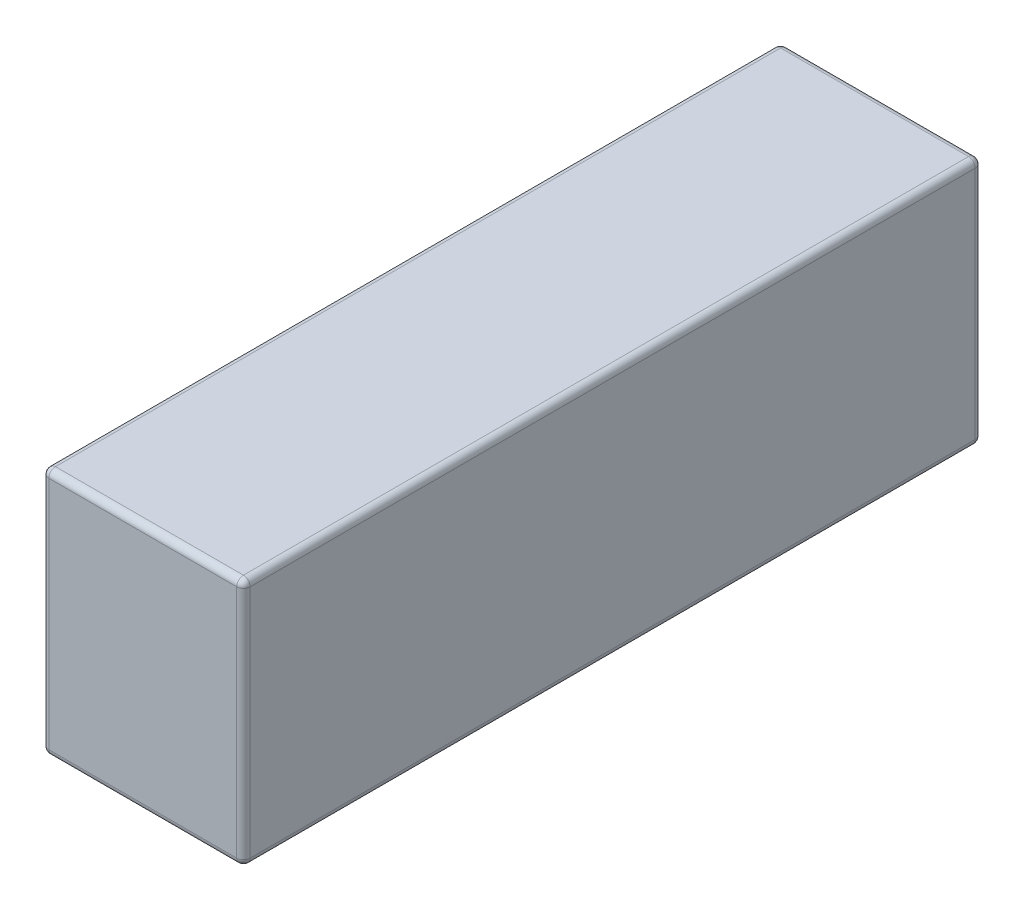
ISO-10303-21;
HEADER;
FILE_DESCRIPTION(('STEP AP214'),'2;1');
FILE_NAME('part.step','',(''),(''),'','','');
FILE_SCHEMA(('AUTOMOTIVE_DESIGN { 1 0 10303 214 1 1 1 1 }'));
ENDSEC;
DATA;
#1=APPLICATION_CONTEXT('core data for automotive mechanical design processes');
#2=APPLICATION_PROTOCOL_DEFINITION('international standard','automotive_design',2000,#1);
#3=PRODUCT_CONTEXT('',#1,'mechanical');
#4=PRODUCT('Part','Part','',(#3));
#5=PRODUCT_RELATED_PRODUCT_CATEGORY('part','',(#4));
#6=PRODUCT_DEFINITION_FORMATION('','',#4);
#7=PRODUCT_DEFINITION_CONTEXT('part definition',#1,'design');
#8=PRODUCT_DEFINITION('design','',#6,#7);
#9=PRODUCT_DEFINITION_SHAPE('','',#8);
#10=(LENGTH_UNIT() NAMED_UNIT(*) SI_UNIT(.MILLI.,.METRE.));
#11=(NAMED_UNIT(*) PLANE_ANGLE_UNIT() SI_UNIT($,.RADIAN.));
#12=(NAMED_UNIT(*) SI_UNIT($,.STERADIAN.) SOLID_ANGLE_UNIT());
#13=UNCERTAINTY_MEASURE_WITH_UNIT(LENGTH_MEASURE(1.E-05),#10,'distance_accuracy_value','');
#14=(GEOMETRIC_REPRESENTATION_CONTEXT(3) GLOBAL_UNCERTAINTY_ASSIGNED_CONTEXT((#13)) GLOBAL_UNIT_ASSIGNED_CONTEXT((#10,
#11,#12)) REPRESENTATION_CONTEXT('',''));
#15=CARTESIAN_POINT('',(0.,0.,0.));
#16=DIRECTION('',(0.,0.,1.));
#17=DIRECTION('',(1.,0.,0.));
#18=AXIS2_PLACEMENT_3D('',#15,#16,#17);
#19=CARTESIAN_POINT('',(-15.,37.,59.5535714285715));
#20=DIRECTION('',(1.,0.,0.));
#21=DIRECTION('',(0.,0.,-1.));
#22=AXIS2_PLACEMENT_3D('',#19,#20,#21);
#23=PLANE('',#22);
#24=DIRECTION('',(0.,0.,1.));
#25=VECTOR('',#24,1.);
#26=CARTESIAN_POINT('',(-15.,36.,-50.4464285714285));
#27=LINE('',#26,#25);
#28=CARTESIAN_POINT('',(-15.,36.,58.5535714285715));
#29=VERTEX_POINT('',#28);
#30=CARTESIAN_POINT('',(-15.,36.,-49.4464285714285));
#31=VERTEX_POINT('',#30);
#32=EDGE_CURVE('E173',#29,#31,#27,.F.);
#33=ORIENTED_EDGE('',*,*,#32,.T.);
#34=DIRECTION('',(0.,-1.,0.));
#35=VECTOR('',#34,1.);
#36=CARTESIAN_POINT('',(-15.,37.,-49.4464285714285));
#37=LINE('',#36,#35);
#38=CARTESIAN_POINT('',(-15.,1.,-49.4464285714285));
#39=VERTEX_POINT('',#38);
#40=EDGE_CURVE('E179',#31,#39,#37,.T.);
#41=ORIENTED_EDGE('',*,*,#40,.T.);
#42=DIRECTION('',(0.,0.,1.));
#43=VECTOR('',#42,1.);
#44=CARTESIAN_POINT('',(-15.,1.,59.5535714285715));
#45=LINE('',#44,#43);
#46=CARTESIAN_POINT('',(-15.,1.,58.5535714285715));
#47=VERTEX_POINT('',#46);
#48=EDGE_CURVE('E177',#39,#47,#45,.T.);
#49=ORIENTED_EDGE('',*,*,#48,.T.);
#50=DIRECTION('',(0.,-1.,0.));
#51=VECTOR('',#50,1.);
#52=CARTESIAN_POINT('',(-15.,37.,58.5535714285715));
#53=LINE('',#52,#51);
#54=EDGE_CURVE('E175',#47,#29,#53,.F.);
#55=ORIENTED_EDGE('',*,*,#54,.T.);
#56=EDGE_LOOP('',(#33,#41,#49,#55));
#57=FACE_BOUND('',#56,.T.);
#58=ADVANCED_FACE('F33',(#57),#23,.F.);
#59=CARTESIAN_POINT('',(15.,37.,59.5535714285715));
#60=DIRECTION('',(0.,0.,-1.));
#61=DIRECTION('',(-1.,0.,0.));
#62=AXIS2_PLACEMENT_3D('',#59,#60,#61);
#63=PLANE('',#62);
#64=DIRECTION('',(1.,0.,0.));
#65=VECTOR('',#64,1.);
#66=CARTESIAN_POINT('',(-15.,36.,59.5535714285715));
#67=LINE('',#66,#65);
#68=CARTESIAN_POINT('',(14.,36.,59.5535714285715));
#69=VERTEX_POINT('',#68);
#70=CARTESIAN_POINT('',(-14.,36.,59.5535714285715));
#71=VERTEX_POINT('',#70);
#72=EDGE_CURVE('E184',#69,#71,#67,.F.);
#73=ORIENTED_EDGE('',*,*,#72,.T.);
#74=DIRECTION('',(0.,-1.,0.));
#75=VECTOR('',#74,1.);
#76=CARTESIAN_POINT('',(-14.,37.,59.5535714285715));
#77=LINE('',#76,#75);
#78=CARTESIAN_POINT('',(-14.,1.,59.5535714285715));
#79=VERTEX_POINT('',#78);
#80=EDGE_CURVE('E188',#71,#79,#77,.T.);
#81=ORIENTED_EDGE('',*,*,#80,.T.);
#82=DIRECTION('',(1.,0.,0.));
#83=VECTOR('',#82,1.);
#84=CARTESIAN_POINT('',(15.,1.,59.5535714285715));
#85=LINE('',#84,#83);
#86=CARTESIAN_POINT('',(14.,1.,59.5535714285715));
#87=VERTEX_POINT('',#86);
#88=EDGE_CURVE('E186',#79,#87,#85,.T.);
#89=ORIENTED_EDGE('',*,*,#88,.T.);
#90=DIRECTION('',(0.,-1.,0.));
#91=VECTOR('',#90,1.);
#92=CARTESIAN_POINT('',(14.,37.,59.5535714285715));
#93=LINE('',#92,#91);
#94=EDGE_CURVE('E182',#87,#69,#93,.F.);
#95=ORIENTED_EDGE('',*,*,#94,.T.);
#96=EDGE_LOOP('',(#73,#81,#89,#95));
#97=FACE_BOUND('',#96,.T.);
#98=ADVANCED_FACE('F272',(#97),#63,.F.);
#99=CARTESIAN_POINT('',(15.,37.,59.5535714285715));
#100=DIRECTION('',(-1.,0.,0.));
#101=DIRECTION('',(0.,0.,1.));
#102=AXIS2_PLACEMENT_3D('',#99,#100,#101);
#103=PLANE('',#102);
#104=DIRECTION('',(0.,0.,-1.));
#105=VECTOR('',#104,1.);
#106=CARTESIAN_POINT('',(15.,36.,59.5535714285715));
#107=LINE('',#106,#105);
#108=CARTESIAN_POINT('',(15.,36.,-49.4464285714285));
#109=VERTEX_POINT('',#108);
#110=CARTESIAN_POINT('',(15.,36.,58.5535714285715));
#111=VERTEX_POINT('',#110);
#112=EDGE_CURVE('E42',#109,#111,#107,.F.);
#113=ORIENTED_EDGE('',*,*,#112,.T.);
#114=DIRECTION('',(0.,-1.,0.));
#115=VECTOR('',#114,1.);
#116=CARTESIAN_POINT('',(15.,37.,58.5535714285715));
#117=LINE('',#116,#115);
#118=CARTESIAN_POINT('',(15.,1.,58.5535714285715));
#119=VERTEX_POINT('',#118);
#120=EDGE_CURVE('E11',#111,#119,#117,.T.);
#121=ORIENTED_EDGE('',*,*,#120,.T.);
#122=DIRECTION('',(0.,0.,-1.));
#123=VECTOR('',#122,1.);
#124=CARTESIAN_POINT('',(15.,1.,59.5535714285715));
#125=LINE('',#124,#123);
#126=CARTESIAN_POINT('',(15.,1.,-49.4464285714285));
#127=VERTEX_POINT('',#126);
#128=EDGE_CURVE('E198',#119,#127,#125,.T.);
#129=ORIENTED_EDGE('',*,*,#128,.T.);
#130=DIRECTION('',(0.,-1.,0.));
#131=VECTOR('',#130,1.);
#132=CARTESIAN_POINT('',(15.,37.,-49.4464285714285));
#133=LINE('',#132,#131);
#134=EDGE_CURVE('E53',#127,#109,#133,.F.);
#135=ORIENTED_EDGE('',*,*,#134,.T.);
#136=EDGE_LOOP('',(#113,#121,#129,#135));
#137=FACE_BOUND('',#136,.T.);
#138=ADVANCED_FACE('F285',(#137),#103,.F.);
#139=CARTESIAN_POINT('',(15.,37.,-50.4464285714285));
#140=DIRECTION('',(0.,0.,1.));
#141=DIRECTION('',(1.,0.,0.));
#142=AXIS2_PLACEMENT_3D('',#139,#140,#141);
#143=PLANE('',#142);
#144=DIRECTION('',(0.,-1.,0.));
#145=VECTOR('',#144,1.);
#146=CARTESIAN_POINT('',(14.,37.,-50.4464285714285));
#147=LINE('',#146,#145);
#148=CARTESIAN_POINT('',(14.,36.,-50.4464285714285));
#149=VERTEX_POINT('',#148);
#150=CARTESIAN_POINT('',(14.,1.,-50.4464285714285));
#151=VERTEX_POINT('',#150);
#152=EDGE_CURVE('E125',#149,#151,#147,.T.);
#153=ORIENTED_EDGE('',*,*,#152,.T.);
#154=DIRECTION('',(-1.,0.,0.));
#155=VECTOR('',#154,1.);
#156=CARTESIAN_POINT('',(15.,1.,-50.4464285714285));
#157=LINE('',#156,#155);
#158=CARTESIAN_POINT('',(-14.,1.,-50.4464285714285));
#159=VERTEX_POINT('',#158);
#160=EDGE_CURVE('E162',#151,#159,#157,.T.);
#161=ORIENTED_EDGE('',*,*,#160,.T.);
#162=DIRECTION('',(0.,-1.,0.));
#163=VECTOR('',#162,1.);
#164=CARTESIAN_POINT('',(-14.,37.,-50.4464285714285));
#165=LINE('',#164,#163);
#166=CARTESIAN_POINT('',(-14.,36.,-50.4464285714285));
#167=VERTEX_POINT('',#166);
#168=EDGE_CURVE('E128',#159,#167,#165,.F.);
#169=ORIENTED_EDGE('',*,*,#168,.T.);
#170=DIRECTION('',(-1.,0.,0.));
#171=VECTOR('',#170,1.);
#172=CARTESIAN_POINT('',(15.,36.,-50.4464285714285));
#173=LINE('',#172,#171);
#174=EDGE_CURVE('E120',#167,#149,#173,.F.);
#175=ORIENTED_EDGE('',*,*,#174,.T.);
#176=EDGE_LOOP('',(#153,#161,#169,#175));
#177=FACE_BOUND('',#176,.T.);
#178=ADVANCED_FACE('F122',(#177),#143,.F.);
#179=CARTESIAN_POINT('',(0.,37.,0.));
#180=DIRECTION('',(0.,1.,0.));
#181=DIRECTION('',(0.,0.,1.));
#182=AXIS2_PLACEMENT_3D('',#179,#180,#181);
#183=PLANE('',#182);
#184=DIRECTION('',(-1.,0.,0.));
#185=VECTOR('',#184,1.);
#186=CARTESIAN_POINT('',(-15.,37.,-49.4464285714285));
#187=LINE('',#186,#185);
#188=CARTESIAN_POINT('',(14.,37.,-49.4464285714285));
#189=VERTEX_POINT('',#188);
#190=CARTESIAN_POINT('',(-14.,37.,-49.4464285714285));
#191=VERTEX_POINT('',#190);
#192=EDGE_CURVE('E139',#189,#191,#187,.T.);
#193=ORIENTED_EDGE('',*,*,#192,.T.);
#194=DIRECTION('',(0.,0.,1.));
#195=VECTOR('',#194,1.);
#196=CARTESIAN_POINT('',(-14.,37.,59.5535714285715));
#197=LINE('',#196,#195);
#198=CARTESIAN_POINT('',(-14.,37.,58.5535714285715));
#199=VERTEX_POINT('',#198);
#200=EDGE_CURVE('E196',#191,#199,#197,.T.);
#201=ORIENTED_EDGE('',*,*,#200,.T.);
#202=DIRECTION('',(1.,0.,0.));
#203=VECTOR('',#202,1.);
#204=CARTESIAN_POINT('',(15.,37.,58.5535714285715));
#205=LINE('',#204,#203);
#206=CARTESIAN_POINT('',(14.,37.,58.5535714285715));
#207=VERTEX_POINT('',#206);
#208=EDGE_CURVE('E193',#199,#207,#205,.T.);
#209=ORIENTED_EDGE('',*,*,#208,.T.);
#210=DIRECTION('',(0.,0.,-1.));
#211=VECTOR('',#210,1.);
#212=CARTESIAN_POINT('',(14.,37.,-50.4464285714285));
#213=LINE('',#212,#211);
#214=EDGE_CURVE('E191',#207,#189,#213,.T.);
#215=ORIENTED_EDGE('',*,*,#214,.T.);
#216=EDGE_LOOP('',(#193,#201,#209,#215));
#217=FACE_BOUND('',#216,.T.);
#218=ADVANCED_FACE('F477',(#217),#183,.T.);
#219=CARTESIAN_POINT('',(0.,0.,0.));
#220=DIRECTION('',(0.,1.,0.));
#221=DIRECTION('',(0.,0.,1.));
#222=AXIS2_PLACEMENT_3D('',#219,#220,#221);
#223=PLANE('',#222);
#224=DIRECTION('',(0.,0.,1.));
#225=VECTOR('',#224,1.);
#226=CARTESIAN_POINT('',(-14.,0.,0.));
#227=LINE('',#226,#225);
#228=CARTESIAN_POINT('',(-14.,0.,58.5535714285715));
#229=VERTEX_POINT('',#228);
#230=CARTESIAN_POINT('',(-14.,0.,-49.4464285714285));
#231=VERTEX_POINT('',#230);
#232=EDGE_CURVE('E168',#229,#231,#227,.F.);
#233=ORIENTED_EDGE('',*,*,#232,.T.);
#234=DIRECTION('',(-1.,0.,0.));
#235=VECTOR('',#234,1.);
#236=CARTESIAN_POINT('',(0.,0.,-49.4464285714285));
#237=LINE('',#236,#235);
#238=CARTESIAN_POINT('',(14.,0.,-49.4464285714285));
#239=VERTEX_POINT('',#238);
#240=EDGE_CURVE('E170',#231,#239,#237,.F.);
#241=ORIENTED_EDGE('',*,*,#240,.T.);
#242=DIRECTION('',(0.,0.,-1.));
#243=VECTOR('',#242,1.);
#244=CARTESIAN_POINT('',(14.,0.,0.));
#245=LINE('',#244,#243);
#246=CARTESIAN_POINT('',(14.,0.,58.5535714285715));
#247=VERTEX_POINT('',#246);
#248=EDGE_CURVE('E164',#239,#247,#245,.F.);
#249=ORIENTED_EDGE('',*,*,#248,.T.);
#250=DIRECTION('',(1.,0.,0.));
#251=VECTOR('',#250,1.);
#252=CARTESIAN_POINT('',(0.,0.,58.5535714285715));
#253=LINE('',#252,#251);
#254=EDGE_CURVE('E166',#247,#229,#253,.F.);
#255=ORIENTED_EDGE('',*,*,#254,.T.);
#256=EDGE_LOOP('',(#233,#241,#249,#255));
#257=FACE_BOUND('',#256,.T.);
#258=ADVANCED_FACE('F470',(#257),#223,.F.);
#259=CARTESIAN_POINT('',(0.,36.,58.5535714285715));
#260=DIRECTION('',(-1.,0.,0.));
#261=DIRECTION('',(0.,0.,1.));
#262=AXIS2_PLACEMENT_3D('',#259,#260,#261);
#263=CYLINDRICAL_SURFACE('',#262,1.);
#264=CARTESIAN_POINT('',(14.,36.,58.5535714285715));
#265=DIRECTION('',(1.,0.,0.));
#266=DIRECTION('',(0.,0.,-1.));
#267=AXIS2_PLACEMENT_3D('',#264,#265,#266);
#268=CIRCLE('',#267,1.);
#269=EDGE_CURVE('E37',#207,#69,#268,.T.);
#270=ORIENTED_EDGE('',*,*,#269,.F.);
#271=ORIENTED_EDGE('',*,*,#208,.F.);
#272=CARTESIAN_POINT('',(-14.,36.,58.5535714285715));
#273=DIRECTION('',(-1.,0.,0.));
#274=DIRECTION('',(0.,0.,1.));
#275=AXIS2_PLACEMENT_3D('',#272,#273,#274);
#276=CIRCLE('',#275,1.);
#277=EDGE_CURVE('E159',#71,#199,#276,.T.);
#278=ORIENTED_EDGE('',*,*,#277,.F.);
#279=ORIENTED_EDGE('',*,*,#72,.F.);
#280=EDGE_LOOP('',(#270,#271,#278,#279));
#281=FACE_BOUND('',#280,.T.);
#282=ADVANCED_FACE('F35',(#281),#263,.T.);
#283=CARTESIAN_POINT('',(14.,36.,58.5535714285715));
#284=DIRECTION('',(0.,0.,1.));
#285=DIRECTION('',(1.,0.,0.));
#286=AXIS2_PLACEMENT_3D('',#283,#284,#285);
#287=SPHERICAL_SURFACE('',#286,1.);
#288=CARTESIAN_POINT('',(14.,36.,58.5535714285715));
#289=DIRECTION('',(0.,0.,1.));
#290=DIRECTION('',(1.,0.,0.));
#291=AXIS2_PLACEMENT_3D('',#288,#289,#290);
#292=CIRCLE('',#291,1.);
#293=EDGE_CURVE('E243',#207,#111,#292,.F.);
#294=ORIENTED_EDGE('',*,*,#293,.F.);
#295=ORIENTED_EDGE('',*,*,#269,.T.);
#296=CARTESIAN_POINT('',(14.,36.,58.5535714285715));
#297=DIRECTION('',(0.,1.,0.));
#298=DIRECTION('',(0.,0.,1.));
#299=AXIS2_PLACEMENT_3D('',#296,#297,#298);
#300=CIRCLE('',#299,1.);
#301=EDGE_CURVE('E245',#111,#69,#300,.F.);
#302=ORIENTED_EDGE('',*,*,#301,.F.);
#303=EDGE_LOOP('',(#294,#295,#302));
#304=FACE_BOUND('',#303,.T.);
#305=ADVANCED_FACE('F278',(#304),#287,.T.);
#306=CARTESIAN_POINT('',(-14.,36.,58.5535714285715));
#307=DIRECTION('',(0.,0.,1.));
#308=DIRECTION('',(1.,0.,0.));
#309=AXIS2_PLACEMENT_3D('',#306,#307,#308);
#310=SPHERICAL_SURFACE('',#309,1.);
#311=CARTESIAN_POINT('',(-14.,36.,58.5535714285715));
#312=DIRECTION('',(0.,1.,0.));
#313=DIRECTION('',(0.,0.,1.));
#314=AXIS2_PLACEMENT_3D('',#311,#312,#313);
#315=CIRCLE('',#314,1.);
#316=EDGE_CURVE('E237',#71,#29,#315,.F.);
#317=ORIENTED_EDGE('',*,*,#316,.F.);
#318=ORIENTED_EDGE('',*,*,#277,.T.);
#319=CARTESIAN_POINT('',(-14.,36.,58.5535714285715));
#320=DIRECTION('',(0.,0.,1.));
#321=DIRECTION('',(1.,0.,0.));
#322=AXIS2_PLACEMENT_3D('',#319,#320,#321);
#323=CIRCLE('',#322,1.);
#324=EDGE_CURVE('E240',#29,#199,#323,.F.);
#325=ORIENTED_EDGE('',*,*,#324,.F.);
#326=EDGE_LOOP('',(#317,#318,#325));
#327=FACE_BOUND('',#326,.T.);
#328=ADVANCED_FACE('F252',(#327),#310,.T.);
#329=CARTESIAN_POINT('',(14.,37.,58.5535714285715));
#330=DIRECTION('',(0.,-1.,0.));
#331=DIRECTION('',(0.,0.,-1.));
#332=AXIS2_PLACEMENT_3D('',#329,#330,#331);
#333=CYLINDRICAL_SURFACE('',#332,1.);
#334=ORIENTED_EDGE('',*,*,#301,.T.);
#335=ORIENTED_EDGE('',*,*,#94,.F.);
#336=CARTESIAN_POINT('',(14.,1.,58.5535714285715));
#337=DIRECTION('',(0.,-1.,0.));
#338=DIRECTION('',(0.,0.,-1.));
#339=AXIS2_PLACEMENT_3D('',#336,#337,#338);
#340=CIRCLE('',#339,1.);
#341=EDGE_CURVE('E231',#119,#87,#340,.T.);
#342=ORIENTED_EDGE('',*,*,#341,.F.);
#343=ORIENTED_EDGE('',*,*,#120,.F.);
#344=EDGE_LOOP('',(#334,#335,#342,#343));
#345=FACE_BOUND('',#344,.T.);
#346=ADVANCED_FACE('F282',(#345),#333,.T.);
#347=CARTESIAN_POINT('',(14.,36.,0.));
#348=DIRECTION('',(0.,0.,1.));
#349=DIRECTION('',(1.,0.,0.));
#350=AXIS2_PLACEMENT_3D('',#347,#348,#349);
#351=CYLINDRICAL_SURFACE('',#350,1.);
#352=ORIENTED_EDGE('',*,*,#293,.T.);
#353=ORIENTED_EDGE('',*,*,#112,.F.);
#354=CARTESIAN_POINT('',(14.,36.,-49.4464285714285));
#355=DIRECTION('',(0.,0.,-1.));
#356=DIRECTION('',(-1.,0.,0.));
#357=AXIS2_PLACEMENT_3D('',#354,#355,#356);
#358=CIRCLE('',#357,1.);
#359=EDGE_CURVE('E143',#189,#109,#358,.T.);
#360=ORIENTED_EDGE('',*,*,#359,.F.);
#361=ORIENTED_EDGE('',*,*,#214,.F.);
#362=EDGE_LOOP('',(#352,#353,#360,#361));
#363=FACE_BOUND('',#362,.T.);
#364=ADVANCED_FACE('F434',(#363),#351,.T.);
#365=CARTESIAN_POINT('',(0.,36.,-49.4464285714285));
#366=DIRECTION('',(1.,0.,0.));
#367=DIRECTION('',(0.,0.,-1.));
#368=AXIS2_PLACEMENT_3D('',#365,#366,#367);
#369=CYLINDRICAL_SURFACE('',#368,1.);
#370=CARTESIAN_POINT('',(-14.,36.,-49.4464285714285));
#371=DIRECTION('',(-1.,0.,0.));
#372=DIRECTION('',(0.,0.,1.));
#373=AXIS2_PLACEMENT_3D('',#370,#371,#372);
#374=CIRCLE('',#373,1.);
#375=EDGE_CURVE('E144',#191,#167,#374,.T.);
#376=ORIENTED_EDGE('',*,*,#375,.F.);
#377=ORIENTED_EDGE('',*,*,#192,.F.);
#378=CARTESIAN_POINT('',(14.,36.,-49.4464285714285));
#379=DIRECTION('',(1.,0.,0.));
#380=DIRECTION('',(0.,0.,-1.));
#381=AXIS2_PLACEMENT_3D('',#378,#379,#380);
#382=CIRCLE('',#381,1.);
#383=EDGE_CURVE('E135',#149,#189,#382,.T.);
#384=ORIENTED_EDGE('',*,*,#383,.F.);
#385=ORIENTED_EDGE('',*,*,#174,.F.);
#386=EDGE_LOOP('',(#376,#377,#384,#385));
#387=FACE_BOUND('',#386,.T.);
#388=ADVANCED_FACE('F137',(#387),#369,.T.);
#389=CARTESIAN_POINT('',(-14.,36.,0.));
#390=DIRECTION('',(0.,0.,-1.));
#391=DIRECTION('',(-1.,0.,0.));
#392=AXIS2_PLACEMENT_3D('',#389,#390,#391);
#393=CYLINDRICAL_SURFACE('',#392,1.);
#394=ORIENTED_EDGE('',*,*,#324,.T.);
#395=ORIENTED_EDGE('',*,*,#200,.F.);
#396=CARTESIAN_POINT('',(-14.,36.,-49.4464285714285));
#397=DIRECTION('',(0.,0.,-1.));
#398=DIRECTION('',(-1.,0.,0.));
#399=AXIS2_PLACEMENT_3D('',#396,#397,#398);
#400=CIRCLE('',#399,1.);
#401=EDGE_CURVE('E227',#31,#191,#400,.T.);
#402=ORIENTED_EDGE('',*,*,#401,.F.);
#403=ORIENTED_EDGE('',*,*,#32,.F.);
#404=EDGE_LOOP('',(#394,#395,#402,#403));
#405=FACE_BOUND('',#404,.T.);
#406=ADVANCED_FACE('F260',(#405),#393,.T.);
#407=CARTESIAN_POINT('',(-14.,37.,58.5535714285715));
#408=DIRECTION('',(0.,-1.,0.));
#409=DIRECTION('',(0.,0.,-1.));
#410=AXIS2_PLACEMENT_3D('',#407,#408,#409);
#411=CYLINDRICAL_SURFACE('',#410,1.);
#412=ORIENTED_EDGE('',*,*,#316,.T.);
#413=ORIENTED_EDGE('',*,*,#54,.F.);
#414=CARTESIAN_POINT('',(-14.,1.,58.5535714285715));
#415=DIRECTION('',(0.,-1.,0.));
#416=DIRECTION('',(0.,0.,-1.));
#417=AXIS2_PLACEMENT_3D('',#414,#415,#416);
#418=CIRCLE('',#417,1.);
#419=EDGE_CURVE('E224',#79,#47,#418,.T.);
#420=ORIENTED_EDGE('',*,*,#419,.F.);
#421=ORIENTED_EDGE('',*,*,#80,.F.);
#422=EDGE_LOOP('',(#412,#413,#420,#421));
#423=FACE_BOUND('',#422,.T.);
#424=ADVANCED_FACE('F269',(#423),#411,.T.);
#425=CARTESIAN_POINT('',(15.,1.,58.5535714285715));
#426=DIRECTION('',(1.,0.,0.));
#427=DIRECTION('',(0.,0.,-1.));
#428=AXIS2_PLACEMENT_3D('',#425,#426,#427);
#429=CYLINDRICAL_SURFACE('',#428,1.);
#430=CARTESIAN_POINT('',(14.,1.,58.5535714285715));
#431=DIRECTION('',(1.,0.,0.));
#432=DIRECTION('',(0.,0.,-1.));
#433=AXIS2_PLACEMENT_3D('',#430,#431,#432);
#434=CIRCLE('',#433,1.);
#435=EDGE_CURVE('E234',#87,#247,#434,.T.);
#436=ORIENTED_EDGE('',*,*,#435,.F.);
#437=ORIENTED_EDGE('',*,*,#88,.F.);
#438=CARTESIAN_POINT('',(-14.,1.,58.5535714285715));
#439=DIRECTION('',(-1.,0.,0.));
#440=DIRECTION('',(0.,0.,1.));
#441=AXIS2_PLACEMENT_3D('',#438,#439,#440);
#442=CIRCLE('',#441,1.);
#443=EDGE_CURVE('E222',#229,#79,#442,.T.);
#444=ORIENTED_EDGE('',*,*,#443,.F.);
#445=ORIENTED_EDGE('',*,*,#254,.F.);
#446=EDGE_LOOP('',(#436,#437,#444,#445));
#447=FACE_BOUND('',#446,.T.);
#448=ADVANCED_FACE('F403',(#447),#429,.T.);
#449=CARTESIAN_POINT('',(14.,1.,58.5535714285715));
#450=DIRECTION('',(0.,0.,1.));
#451=DIRECTION('',(1.,0.,0.));
#452=AXIS2_PLACEMENT_3D('',#449,#450,#451);
#453=SPHERICAL_SURFACE('',#452,1.);
#454=ORIENTED_EDGE('',*,*,#341,.T.);
#455=ORIENTED_EDGE('',*,*,#435,.T.);
#456=CARTESIAN_POINT('',(14.,1.,58.5535714285715));
#457=DIRECTION('',(0.,0.,1.));
#458=DIRECTION('',(1.,0.,0.));
#459=AXIS2_PLACEMENT_3D('',#456,#457,#458);
#460=CIRCLE('',#459,1.);
#461=EDGE_CURVE('E150',#119,#247,#460,.F.);
#462=ORIENTED_EDGE('',*,*,#461,.F.);
#463=EDGE_LOOP('',(#454,#455,#462));
#464=FACE_BOUND('',#463,.T.);
#465=ADVANCED_FACE('F315',(#464),#453,.T.);
#466=CARTESIAN_POINT('',(14.,36.,-49.4464285714285));
#467=DIRECTION('',(0.,0.,1.));
#468=DIRECTION('',(1.,0.,0.));
#469=AXIS2_PLACEMENT_3D('',#466,#467,#468);
#470=SPHERICAL_SURFACE('',#469,1.);
#471=ORIENTED_EDGE('',*,*,#383,.T.);
#472=ORIENTED_EDGE('',*,*,#359,.T.);
#473=CARTESIAN_POINT('',(14.,36.,-49.4464285714285));
#474=DIRECTION('',(0.,1.,0.));
#475=DIRECTION('',(0.,0.,1.));
#476=AXIS2_PLACEMENT_3D('',#473,#474,#475);
#477=CIRCLE('',#476,1.);
#478=EDGE_CURVE('E147',#149,#109,#477,.F.);
#479=ORIENTED_EDGE('',*,*,#478,.F.);
#480=EDGE_LOOP('',(#471,#472,#479));
#481=FACE_BOUND('',#480,.T.);
#482=ADVANCED_FACE('F148',(#481),#470,.T.);
#483=CARTESIAN_POINT('',(-14.,36.,-49.4464285714285));
#484=DIRECTION('',(0.,0.,1.));
#485=DIRECTION('',(1.,0.,0.));
#486=AXIS2_PLACEMENT_3D('',#483,#484,#485);
#487=SPHERICAL_SURFACE('',#486,1.);
#488=ORIENTED_EDGE('',*,*,#401,.T.);
#489=ORIENTED_EDGE('',*,*,#375,.T.);
#490=CARTESIAN_POINT('',(-14.,36.,-49.4464285714285));
#491=DIRECTION('',(0.,1.,0.));
#492=DIRECTION('',(0.,0.,1.));
#493=AXIS2_PLACEMENT_3D('',#490,#491,#492);
#494=CIRCLE('',#493,1.);
#495=EDGE_CURVE('E151',#31,#167,#494,.F.);
#496=ORIENTED_EDGE('',*,*,#495,.F.);
#497=EDGE_LOOP('',(#488,#489,#496));
#498=FACE_BOUND('',#497,.T.);
#499=ADVANCED_FACE('F305',(#498),#487,.T.);
#500=CARTESIAN_POINT('',(-14.,1.,58.5535714285715));
#501=DIRECTION('',(0.,0.,1.));
#502=DIRECTION('',(1.,0.,0.));
#503=AXIS2_PLACEMENT_3D('',#500,#501,#502);
#504=SPHERICAL_SURFACE('',#503,1.);
#505=ORIENTED_EDGE('',*,*,#443,.T.);
#506=ORIENTED_EDGE('',*,*,#419,.T.);
#507=CARTESIAN_POINT('',(-14.,1.,58.5535714285715));
#508=DIRECTION('',(0.,0.,1.));
#509=DIRECTION('',(1.,0.,0.));
#510=AXIS2_PLACEMENT_3D('',#507,#508,#509);
#511=CIRCLE('',#510,1.);
#512=EDGE_CURVE('E215',#229,#47,#511,.F.);
#513=ORIENTED_EDGE('',*,*,#512,.F.);
#514=EDGE_LOOP('',(#505,#506,#513));
#515=FACE_BOUND('',#514,.T.);
#516=ADVANCED_FACE('F307',(#515),#504,.T.);
#517=CARTESIAN_POINT('',(14.,1.,59.5535714285715));
#518=DIRECTION('',(0.,0.,-1.));
#519=DIRECTION('',(-1.,0.,0.));
#520=AXIS2_PLACEMENT_3D('',#517,#518,#519);
#521=CYLINDRICAL_SURFACE('',#520,1.);
#522=ORIENTED_EDGE('',*,*,#461,.T.);
#523=ORIENTED_EDGE('',*,*,#248,.F.);
#524=CARTESIAN_POINT('',(14.,1.,-49.4464285714285));
#525=DIRECTION('',(0.,0.,-1.));
#526=DIRECTION('',(-1.,0.,0.));
#527=AXIS2_PLACEMENT_3D('',#524,#525,#526);
#528=CIRCLE('',#527,1.);
#529=EDGE_CURVE('E212',#127,#239,#528,.T.);
#530=ORIENTED_EDGE('',*,*,#529,.F.);
#531=ORIENTED_EDGE('',*,*,#128,.F.);
#532=EDGE_LOOP('',(#522,#523,#530,#531));
#533=FACE_BOUND('',#532,.T.);
#534=ADVANCED_FACE('F290',(#533),#521,.T.);
#535=CARTESIAN_POINT('',(14.,37.,-49.4464285714285));
#536=DIRECTION('',(0.,-1.,0.));
#537=DIRECTION('',(0.,0.,-1.));
#538=AXIS2_PLACEMENT_3D('',#535,#536,#537);
#539=CYLINDRICAL_SURFACE('',#538,1.);
#540=ORIENTED_EDGE('',*,*,#478,.T.);
#541=ORIENTED_EDGE('',*,*,#134,.F.);
#542=CARTESIAN_POINT('',(14.,1.,-49.4464285714285));
#543=DIRECTION('',(0.,-1.,0.));
#544=DIRECTION('',(0.,0.,-1.));
#545=AXIS2_PLACEMENT_3D('',#542,#543,#544);
#546=CIRCLE('',#545,1.);
#547=EDGE_CURVE('E155',#151,#127,#546,.T.);
#548=ORIENTED_EDGE('',*,*,#547,.F.);
#549=ORIENTED_EDGE('',*,*,#152,.F.);
#550=EDGE_LOOP('',(#540,#541,#548,#549));
#551=FACE_BOUND('',#550,.T.);
#552=ADVANCED_FACE('F153',(#551),#539,.T.);
#553=CARTESIAN_POINT('',(-14.,37.,-49.4464285714285));
#554=DIRECTION('',(0.,-1.,0.));
#555=DIRECTION('',(0.,0.,-1.));
#556=AXIS2_PLACEMENT_3D('',#553,#554,#555);
#557=CYLINDRICAL_SURFACE('',#556,1.);
#558=ORIENTED_EDGE('',*,*,#495,.T.);
#559=ORIENTED_EDGE('',*,*,#168,.F.);
#560=CARTESIAN_POINT('',(-14.,1.,-49.4464285714285));
#561=DIRECTION('',(0.,-1.,0.));
#562=DIRECTION('',(0.,0.,-1.));
#563=AXIS2_PLACEMENT_3D('',#560,#561,#562);
#564=CIRCLE('',#563,1.);
#565=EDGE_CURVE('E208',#39,#159,#564,.T.);
#566=ORIENTED_EDGE('',*,*,#565,.F.);
#567=ORIENTED_EDGE('',*,*,#40,.F.);
#568=EDGE_LOOP('',(#558,#559,#566,#567));
#569=FACE_BOUND('',#568,.T.);
#570=ADVANCED_FACE('F303',(#569),#557,.T.);
#571=CARTESIAN_POINT('',(-14.,1.,59.5535714285715));
#572=DIRECTION('',(0.,0.,1.));
#573=DIRECTION('',(1.,0.,0.));
#574=AXIS2_PLACEMENT_3D('',#571,#572,#573);
#575=CYLINDRICAL_SURFACE('',#574,1.);
#576=ORIENTED_EDGE('',*,*,#512,.T.);
#577=ORIENTED_EDGE('',*,*,#48,.F.);
#578=CARTESIAN_POINT('',(-14.,1.,-49.4464285714285));
#579=DIRECTION('',(0.,0.,-1.));
#580=DIRECTION('',(-1.,0.,0.));
#581=AXIS2_PLACEMENT_3D('',#578,#579,#580);
#582=CIRCLE('',#581,1.);
#583=EDGE_CURVE('E206',#231,#39,#582,.T.);
#584=ORIENTED_EDGE('',*,*,#583,.F.);
#585=ORIENTED_EDGE('',*,*,#232,.F.);
#586=EDGE_LOOP('',(#576,#577,#584,#585));
#587=FACE_BOUND('',#586,.T.);
#588=ADVANCED_FACE('F331',(#587),#575,.T.);
#589=CARTESIAN_POINT('',(14.,1.,-49.4464285714285));
#590=DIRECTION('',(0.,0.,1.));
#591=DIRECTION('',(1.,0.,0.));
#592=AXIS2_PLACEMENT_3D('',#589,#590,#591);
#593=SPHERICAL_SURFACE('',#592,1.);
#594=ORIENTED_EDGE('',*,*,#547,.T.);
#595=ORIENTED_EDGE('',*,*,#529,.T.);
#596=CARTESIAN_POINT('',(14.,1.,-49.4464285714285));
#597=DIRECTION('',(1.,0.,0.));
#598=DIRECTION('',(0.,0.,-1.));
#599=AXIS2_PLACEMENT_3D('',#596,#597,#598);
#600=CIRCLE('',#599,1.);
#601=EDGE_CURVE('E204',#151,#239,#600,.F.);
#602=ORIENTED_EDGE('',*,*,#601,.F.);
#603=EDGE_LOOP('',(#594,#595,#602));
#604=FACE_BOUND('',#603,.T.);
#605=ADVANCED_FACE('F292',(#604),#593,.T.);
#606=CARTESIAN_POINT('',(-14.,1.,-49.4464285714285));
#607=DIRECTION('',(0.,0.,1.));
#608=DIRECTION('',(1.,0.,0.));
#609=AXIS2_PLACEMENT_3D('',#606,#607,#608);
#610=SPHERICAL_SURFACE('',#609,1.);
#611=ORIENTED_EDGE('',*,*,#583,.T.);
#612=ORIENTED_EDGE('',*,*,#565,.T.);
#613=CARTESIAN_POINT('',(-14.,1.,-49.4464285714285));
#614=DIRECTION('',(-1.,0.,0.));
#615=DIRECTION('',(0.,0.,1.));
#616=AXIS2_PLACEMENT_3D('',#613,#614,#615);
#617=CIRCLE('',#616,1.);
#618=EDGE_CURVE('E202',#231,#159,#617,.F.);
#619=ORIENTED_EDGE('',*,*,#618,.F.);
#620=EDGE_LOOP('',(#611,#612,#619));
#621=FACE_BOUND('',#620,.T.);
#622=ADVANCED_FACE('F300',(#621),#610,.T.);
#623=CARTESIAN_POINT('',(15.,1.,-49.4464285714285));
#624=DIRECTION('',(-1.,0.,0.));
#625=DIRECTION('',(0.,0.,1.));
#626=AXIS2_PLACEMENT_3D('',#623,#624,#625);
#627=CYLINDRICAL_SURFACE('',#626,1.);
#628=ORIENTED_EDGE('',*,*,#601,.T.);
#629=ORIENTED_EDGE('',*,*,#240,.F.);
#630=ORIENTED_EDGE('',*,*,#618,.T.);
#631=ORIENTED_EDGE('',*,*,#160,.F.);
#632=EDGE_LOOP('',(#628,#629,#630,#631));
#633=FACE_BOUND('',#632,.T.);
#634=ADVANCED_FACE('F296',(#633),#627,.T.);
#635=CLOSED_SHELL('',(#58,#98,#138,#178,#218,#258,#282,#305,#328,#346,#364,#388,#406,#424,#448,
#465,#482,#499,#516,#534,#552,#570,#588,#605,#622,#634));
#636=MANIFOLD_SOLID_BREP('B2',#635);
#637=ADVANCED_BREP_SHAPE_REPRESENTATION('',(#18,#636),#14);
#638=SHAPE_DEFINITION_REPRESENTATION(#9,#637);
ENDSEC;
END-ISO-10303-21;
